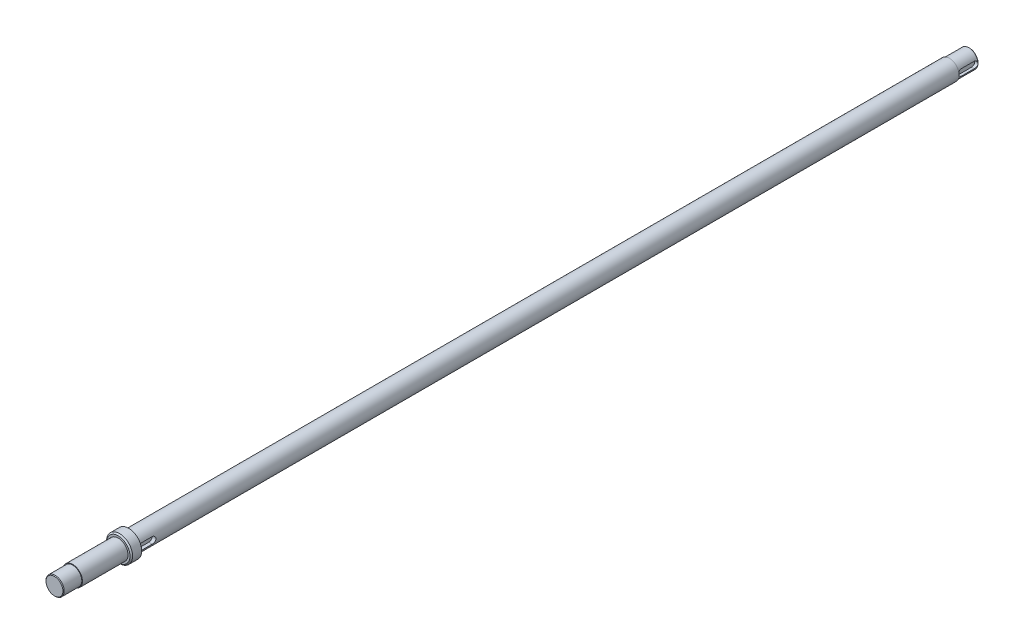
ISO-10303-21;
HEADER;
FILE_DESCRIPTION(('STEP AP214'),'2;1');
FILE_NAME('part.step','',(''),(''),'','','');
FILE_SCHEMA(('AUTOMOTIVE_DESIGN { 1 0 10303 214 1 1 1 1 }'));
ENDSEC;
DATA;
#1=APPLICATION_CONTEXT('core data for automotive mechanical design processes');
#2=APPLICATION_PROTOCOL_DEFINITION('international standard','automotive_design',2000,#1);
#3=PRODUCT_CONTEXT('',#1,'mechanical');
#4=PRODUCT('Part','Part','',(#3));
#5=PRODUCT_RELATED_PRODUCT_CATEGORY('part','',(#4));
#6=PRODUCT_DEFINITION_FORMATION('','',#4);
#7=PRODUCT_DEFINITION_CONTEXT('part definition',#1,'design');
#8=PRODUCT_DEFINITION('design','',#6,#7);
#9=PRODUCT_DEFINITION_SHAPE('','',#8);
#10=(LENGTH_UNIT() NAMED_UNIT(*) SI_UNIT(.MILLI.,.METRE.));
#11=(NAMED_UNIT(*) PLANE_ANGLE_UNIT() SI_UNIT($,.RADIAN.));
#12=(NAMED_UNIT(*) SI_UNIT($,.STERADIAN.) SOLID_ANGLE_UNIT());
#13=UNCERTAINTY_MEASURE_WITH_UNIT(LENGTH_MEASURE(1.E-05),#10,'distance_accuracy_value','');
#14=(GEOMETRIC_REPRESENTATION_CONTEXT(3) GLOBAL_UNCERTAINTY_ASSIGNED_CONTEXT((#13)) GLOBAL_UNIT_ASSIGNED_CONTEXT((#10,
#11,#12)) REPRESENTATION_CONTEXT('',''));
#15=CARTESIAN_POINT('',(0.,0.,0.));
#16=DIRECTION('',(0.,0.,1.));
#17=DIRECTION('',(1.,0.,0.));
#18=AXIS2_PLACEMENT_3D('',#15,#16,#17);
#19=CARTESIAN_POINT('',(0.,0.,0.));
#20=DIRECTION('',(0.,0.,-1.));
#21=DIRECTION('',(-1.,0.,0.));
#22=AXIS2_PLACEMENT_3D('',#19,#20,#21);
#23=CYLINDRICAL_SURFACE('',#22,7.5);
#24=CARTESIAN_POINT('',(0.,0.,-57.));
#25=DIRECTION('',(0.,0.,-1.));
#26=DIRECTION('',(-1.,0.,0.));
#27=AXIS2_PLACEMENT_3D('',#24,#25,#26);
#28=CIRCLE('',#27,7.5);
#29=CARTESIAN_POINT('',(-7.5,0.,-57.));
#30=VERTEX_POINT('',#29);
#31=EDGE_CURVE('E168',#30,#30,#28,.T.);
#32=ORIENTED_EDGE('',*,*,#31,.T.);
#33=EDGE_LOOP('',(#32));
#34=FACE_BOUND('',#33,.T.);
#35=CARTESIAN_POINT('',(0.,0.,-687.5));
#36=DIRECTION('',(0.,0.,-1.));
#37=DIRECTION('',(-1.,0.,0.));
#38=AXIS2_PLACEMENT_3D('',#35,#36,#37);
#39=CIRCLE('',#38,7.5);
#40=CARTESIAN_POINT('',(-7.5,0.,-687.5));
#41=VERTEX_POINT('',#40);
#42=EDGE_CURVE('E165',#41,#41,#39,.T.);
#43=ORIENTED_EDGE('',*,*,#42,.F.);
#44=EDGE_LOOP('',(#43));
#45=FACE_BOUND('',#44,.T.);
#46=DIRECTION('',(0.,0.,-1.));
#47=VECTOR('',#46,1.);
#48=CARTESIAN_POINT('',(7.07106781186548,-2.5,0.));
#49=LINE('',#48,#47);
#50=CARTESIAN_POINT('',(7.07106781186548,-2.5,-68.));
#51=VERTEX_POINT('',#50);
#52=CARTESIAN_POINT('',(7.07106781186548,-2.5,-60.));
#53=VERTEX_POINT('',#52);
#54=EDGE_CURVE('E260',#51,#53,#49,.F.);
#55=ORIENTED_EDGE('',*,*,#54,.T.);
#56=CARTESIAN_POINT('',(7.07106781186548,-2.5,-60.));
#57=CARTESIAN_POINT('',(7.07105693273157,-2.50000899110406,-59.9317929221797));
#58=CARTESIAN_POINT('',(7.07205443904569,-2.49720887221585,-59.8635919253246));
#59=CARTESIAN_POINT('',(7.07598524121008,-2.4860604578047,-59.7277189616508));
#60=CARTESIAN_POINT('',(7.07891801450643,-2.47771365997202,-59.660046857012));
#61=CARTESIAN_POINT('',(7.08662705252507,-2.45557459422795,-59.5259095116455));
#62=CARTESIAN_POINT('',(7.09139784850119,-2.44179847763135,-59.4594412974491));
#63=CARTESIAN_POINT('',(7.10262619906003,-2.4089418103012,-59.3279917314172));
#64=CARTESIAN_POINT('',(7.10908381460331,-2.38986106786032,-59.2630104334101));
#65=CARTESIAN_POINT('',(7.13069940793912,-2.32491551306196,-59.0710384202854));
#66=CARTESIAN_POINT('',(7.14811243884052,-2.2713141681025,-58.94682084253));
#67=CARTESIAN_POINT('',(7.1869703408752,-2.14517784106255,-58.7091231885366));
#68=CARTESIAN_POINT('',(7.20841768551077,-2.07263123268532,-58.5956497642198));
#69=CARTESIAN_POINT('',(7.25386182389479,-1.90762995846819,-58.3782070965292));
#70=CARTESIAN_POINT('',(7.27792189428067,-1.81456284630833,-58.2747148572318));
#71=CARTESIAN_POINT('',(7.32534626726038,-1.61247071190512,-58.0844828967663));
#72=CARTESIAN_POINT('',(7.34871044533519,-1.50344285413658,-57.997746158681));
#73=CARTESIAN_POINT('',(7.39284706096344,-1.26900922493972,-57.8413017757375));
#74=CARTESIAN_POINT('',(7.41353593532888,-1.1432502528446,-57.7720976922578));
#75=CARTESIAN_POINT('',(7.44924021883279,-0.881073095475285,-57.6560192175653));
#76=CARTESIAN_POINT('',(7.46425736081204,-0.744658181225881,-57.6091380050743));
#77=CARTESIAN_POINT('',(7.48647677762783,-0.470073371182907,-57.5406607237417));
#78=CARTESIAN_POINT('',(7.49393272446142,-0.332129588153742,-57.5182418290428));
#79=CARTESIAN_POINT('',(7.50109021034827,-0.0542474216361996,-57.4967092432615));
#80=CARTESIAN_POINT('',(7.50079359709905,0.0856904786402157,-57.4975899990842));
#81=CARTESIAN_POINT('',(7.49265096581776,0.357759612692403,-57.5221107104005));
#82=CARTESIAN_POINT('',(7.48510152476447,0.489981756428172,-57.5448565956047));
#83=CARTESIAN_POINT('',(7.46367401253772,0.748610161077311,-57.6109829959792));
#84=CARTESIAN_POINT('',(7.4497955904479,0.875016099077737,-57.6543646553253));
#85=CARTESIAN_POINT('',(7.41689170677793,1.12038155754034,-57.7610534241945));
#86=CARTESIAN_POINT('',(7.39780094595656,1.23922126412503,-57.8246151128576));
#87=CARTESIAN_POINT('',(7.35645969200236,1.46481147275367,-57.969649878425));
#88=CARTESIAN_POINT('',(7.33420833994017,1.57155867428943,-58.0511278276021));
#89=CARTESIAN_POINT('',(7.28765679856813,1.77524334927518,-58.234177625007));
#90=CARTESIAN_POINT('',(7.26330946699776,1.87148402903098,-58.3365138590283));
#91=CARTESIAN_POINT('',(7.21618726182138,2.04568006205172,-58.5561037242864));
#92=CARTESIAN_POINT('',(7.19341289789386,2.12362950795974,-58.673362156007));
#93=CARTESIAN_POINT('',(7.15175078440791,2.26000831398175,-58.9217004458843));
#94=CARTESIAN_POINT('',(7.13292537370586,2.31813252376915,-59.0529587873326));
#95=CARTESIAN_POINT('',(7.10202742655098,2.41115057675285,-59.3241174439746));
#96=CARTESIAN_POINT('',(7.08994423522482,2.4460810901384,-59.4640037334303));
#97=CARTESIAN_POINT('',(7.078413552368,2.47914539070207,-59.67104659187));
#98=CARTESIAN_POINT('',(7.07566669236505,2.48696265313779,-59.7366034746356));
#99=CARTESIAN_POINT('',(7.07199258928498,2.49738654017799,-59.8680951959995));
#100=CARTESIAN_POINT('',(7.0710629982382,2.49999988848745,-59.934029436361));
#101=CARTESIAN_POINT('',(7.07106781186548,2.5,-60.));
#102=B_SPLINE_CURVE_WITH_KNOTS('',3,(#56,#57,#58,#59,#60,#61,#62,#63,#64,#65,#66,#67,#68,#69,
#70,#71,#72,#73,#74,#75,#76,#77,#78,#79,#80,#81,#82,#83,#84,#85,#86,#87,#88,#89,#90,#91,#92,#93,
#94,#95,#96,#97,#98,#99,#100,#101),.UNSPECIFIED.,.F.,.F.,(4,2,2,2,2,2,2,2,2,2,2,2,2,2,2,2,2,2,2,
2,2,2,4),(0.,0.204546211838573,0.409037215423649,0.612924429429071,0.816819012805388,
1.22401016923255,1.63145179965523,2.0532786408839,2.47518051341064,2.90809434014449,
3.34087579484514,3.75860278500203,4.17623021758301,4.57747647846033,4.97874498952315,
5.38529148746614,5.79194868153617,6.21771736826821,6.64362337304801,7.07581676501795,
7.50732520398793,7.70536340013573,7.90314555504337),.UNSPECIFIED.);
#103=CARTESIAN_POINT('',(7.07106781186548,2.5,-60.));
#104=VERTEX_POINT('',#103);
#105=EDGE_CURVE('E116',#53,#104,#102,.T.);
#106=ORIENTED_EDGE('',*,*,#105,.T.);
#107=DIRECTION('',(0.,0.,-1.));
#108=VECTOR('',#107,1.);
#109=CARTESIAN_POINT('',(7.07106781186548,2.5,0.));
#110=LINE('',#109,#108);
#111=CARTESIAN_POINT('',(7.07106781186548,2.5,-68.));
#112=VERTEX_POINT('',#111);
#113=EDGE_CURVE('E273',#112,#104,#110,.F.);
#114=ORIENTED_EDGE('',*,*,#113,.F.);
#115=CARTESIAN_POINT('',(7.07106781186548,2.5,-68.));
#116=CARTESIAN_POINT('',(7.07105693273157,2.50000899110406,-68.0682070778203));
#117=CARTESIAN_POINT('',(7.07205443904569,2.49720887221585,-68.1364080746754));
#118=CARTESIAN_POINT('',(7.07598524121008,2.4860604578047,-68.2722810383492));
#119=CARTESIAN_POINT('',(7.07891801450643,2.47771365997202,-68.3399531429881));
#120=CARTESIAN_POINT('',(7.08662705252507,2.45557459422795,-68.4740904883545));
#121=CARTESIAN_POINT('',(7.09139784850119,2.44179847763136,-68.5405587025509));
#122=CARTESIAN_POINT('',(7.10262619906002,2.4089418103012,-68.6720082685828));
#123=CARTESIAN_POINT('',(7.10908381460331,2.38986106786032,-68.7369895665899));
#124=CARTESIAN_POINT('',(7.13069940793912,2.32491551306196,-68.9289615797146));
#125=CARTESIAN_POINT('',(7.14811243884052,2.2713141681025,-69.05317915747));
#126=CARTESIAN_POINT('',(7.1869703408752,2.14517784106255,-69.2908768114634));
#127=CARTESIAN_POINT('',(7.20841768551077,2.07263123268532,-69.4043502357802));
#128=CARTESIAN_POINT('',(7.25386182389479,1.90762995846819,-69.6217929034708));
#129=CARTESIAN_POINT('',(7.27792189428067,1.81456284630833,-69.7252851427682));
#130=CARTESIAN_POINT('',(7.32534626726038,1.61247071190513,-69.9155171032337));
#131=CARTESIAN_POINT('',(7.34871044533518,1.50344285413658,-70.002253841319));
#132=CARTESIAN_POINT('',(7.39284706096344,1.26900922493972,-70.1586982242625));
#133=CARTESIAN_POINT('',(7.41353593532888,1.14325025284461,-70.2279023077422));
#134=CARTESIAN_POINT('',(7.44924021883279,0.881073095475288,-70.3439807824347));
#135=CARTESIAN_POINT('',(7.46425736081204,0.74465818122588,-70.3908619949257));
#136=CARTESIAN_POINT('',(7.48647677762783,0.470073371182903,-70.4593392762583));
#137=CARTESIAN_POINT('',(7.49393272446142,0.33212958815374,-70.4817581709572));
#138=CARTESIAN_POINT('',(7.50109021034827,0.0542474216361989,-70.5032907567385));
#139=CARTESIAN_POINT('',(7.50079359709905,-0.0856904786402158,-70.5024100009158));
#140=CARTESIAN_POINT('',(7.49265096581776,-0.357759612692405,-70.4778892895995));
#141=CARTESIAN_POINT('',(7.48510152476447,-0.489981756428177,-70.4551434043953));
#142=CARTESIAN_POINT('',(7.46367401253772,-0.748610161077317,-70.3890170040208));
#143=CARTESIAN_POINT('',(7.4497955904479,-0.87501609907774,-70.3456353446747));
#144=CARTESIAN_POINT('',(7.41689170677793,-1.12038155754035,-70.2389465758056));
#145=CARTESIAN_POINT('',(7.39780094595656,-1.23922126412503,-70.1753848871424));
#146=CARTESIAN_POINT('',(7.35645969200236,-1.46481147275367,-70.030350121575));
#147=CARTESIAN_POINT('',(7.33420833994017,-1.57155867428943,-69.9488721723979));
#148=CARTESIAN_POINT('',(7.28765679856813,-1.77524334927518,-69.765822374993));
#149=CARTESIAN_POINT('',(7.26330946699776,-1.87148402903098,-69.6634861409718));
#150=CARTESIAN_POINT('',(7.21618726182137,-2.04568006205173,-69.4438962757136));
#151=CARTESIAN_POINT('',(7.19341289789386,-2.12362950795974,-69.326637843993));
#152=CARTESIAN_POINT('',(7.15175078440791,-2.26000831398175,-69.0782995541157));
#153=CARTESIAN_POINT('',(7.13292537370586,-2.31813252376915,-68.9470412126674));
#154=CARTESIAN_POINT('',(7.10202742655098,-2.41115057675285,-68.6758825560254));
#155=CARTESIAN_POINT('',(7.08994423522482,-2.4460810901384,-68.5359962665697));
#156=CARTESIAN_POINT('',(7.078413552368,-2.47914539070207,-68.32895340813));
#157=CARTESIAN_POINT('',(7.07566669236505,-2.48696265313778,-68.2633965253644));
#158=CARTESIAN_POINT('',(7.07199258928497,-2.49738654017799,-68.1319048040005));
#159=CARTESIAN_POINT('',(7.0710629982382,-2.49999988848745,-68.065970563639));
#160=CARTESIAN_POINT('',(7.07106781186548,-2.5,-68.));
#161=B_SPLINE_CURVE_WITH_KNOTS('',3,(#115,#116,#117,#118,#119,#120,#121,#122,#123,#124,#125,
#126,#127,#128,#129,#130,#131,#132,#133,#134,#135,#136,#137,#138,#139,#140,#141,#142,#143,#144,
#145,#146,#147,#148,#149,#150,#151,#152,#153,#154,#155,#156,#157,#158,#159,#160),.UNSPECIFIED.,
.F.,.F.,(4,2,2,2,2,2,2,2,2,2,2,2,2,2,2,2,2,2,2,2,2,2,4),(0.,0.204546211838573,0.409037215423635,
0.61292442942907,0.816819012805388,1.22401016923255,1.63145179965522,2.05327864088388,
2.47518051341063,2.90809434014448,3.34087579484514,3.75860278500202,4.17623021758301,
4.57747647846033,4.97874498952315,5.38529148746615,5.79194868153616,6.21771736826821,
6.64362337304802,7.07581676501795,7.50732520398793,7.70536340013573,7.90314555504336),.UNSPECIFIED.);
#162=EDGE_CURVE('E244',#112,#51,#161,.T.);
#163=ORIENTED_EDGE('',*,*,#162,.T.);
#164=EDGE_LOOP('',(#55,#106,#114,#163));
#165=FACE_BOUND('',#164,.T.);
#166=ADVANCED_FACE('F37',(#34,#45,#165),#23,.T.);
#167=CARTESIAN_POINT('',(0.,0.,0.));
#168=DIRECTION('',(0.,0.,-1.));
#169=DIRECTION('',(-1.,0.,0.));
#170=AXIS2_PLACEMENT_3D('',#167,#168,#169);
#171=CYLINDRICAL_SURFACE('',#170,7.);
#172=CARTESIAN_POINT('',(6.53834841531101,2.5,-700.));
#173=CARTESIAN_POINT('',(6.53833653785132,2.50000932220905,-700.067889245729));
#174=CARTESIAN_POINT('',(6.53940549922738,2.49723485076695,-700.135771932639));
#175=CARTESIAN_POINT('',(6.54361657478133,2.4861910211816,-700.271003910611));
#176=CARTESIAN_POINT('',(6.54675805418062,2.47792334551208,-700.338353358606));
#177=CARTESIAN_POINT('',(6.55501217637942,2.456001752859,-700.471821414603));
#178=CARTESIAN_POINT('',(6.56011831705676,2.44236559963955,-700.53794333634));
#179=CARTESIAN_POINT('',(6.57213177854175,2.40985115466648,-700.668701835108));
#180=CARTESIAN_POINT('',(6.57903917900746,2.39097263107435,-700.733338346312));
#181=CARTESIAN_POINT('',(6.6021493436571,2.32673964179204,-700.924264366477));
#182=CARTESIAN_POINT('',(6.62075475340845,2.27375112606984,-701.047790452136));
#183=CARTESIAN_POINT('',(6.66225397360711,2.14910757865423,-701.284230333128));
#184=CARTESIAN_POINT('',(6.68515090424876,2.07743895048848,-701.397136316736));
#185=CARTESIAN_POINT('',(6.73379913792223,1.91402571101972,-701.614215213353));
#186=CARTESIAN_POINT('',(6.7596286404137,1.82158337146748,-701.717846475196));
#187=CARTESIAN_POINT('',(6.81057592323029,1.62073388776336,-701.908508704716));
#188=CARTESIAN_POINT('',(6.83569357019867,1.51232377552679,-701.995536579243));
#189=CARTESIAN_POINT('',(6.88331133279045,1.27853915335942,-702.153089855455));
#190=CARTESIAN_POINT('',(6.90570835223795,1.15274833789196,-702.223031521861));
#191=CARTESIAN_POINT('',(6.94442357672632,0.890250825476732,-702.340536646797));
#192=CARTESIAN_POINT('',(6.96074386585465,0.75354789054038,-702.388107779046));
#193=CARTESIAN_POINT('',(6.9849105051071,0.478829979256186,-702.457640602182));
#194=CARTESIAN_POINT('',(6.99306594352515,0.341079835227481,-702.480539130471));
#195=CARTESIAN_POINT('',(7.00108798053822,0.0634643052969114,-702.503068402778));
#196=CARTESIAN_POINT('',(7.00095687302702,-0.076400484507451,-702.502705586035));
#197=CARTESIAN_POINT('',(6.99262258049077,-0.347593258486963,-702.479288726239));
#198=CARTESIAN_POINT('',(6.98478243583516,-0.479022407078743,-702.457255205801));
#199=CARTESIAN_POINT('',(6.96237832507347,-0.736175812143632,-702.392826575841));
#200=CARTESIAN_POINT('',(6.94781397899037,-0.861899745780486,-702.350430315637));
#201=CARTESIAN_POINT('',(6.91316506890368,-1.10616102429809,-702.245953088435));
#202=CARTESIAN_POINT('',(6.89300592164314,-1.22457279066908,-702.18360428504));
#203=CARTESIAN_POINT('',(6.8492335561632,-1.44953531305526,-702.041220664777));
#204=CARTESIAN_POINT('',(6.82561928959262,-1.55608245176773,-701.961180476216));
#205=CARTESIAN_POINT('',(6.77590547805488,-1.76032445256074,-701.780676736343));
#206=CARTESIAN_POINT('',(6.74974055843873,-1.85724185700423,-701.679350276855));
#207=CARTESIAN_POINT('',(6.69890342468975,-2.03299914621298,-701.461672635834));
#208=CARTESIAN_POINT('',(6.67423174765257,-2.1118325545646,-701.345316094832));
#209=CARTESIAN_POINT('',(6.62877803875406,-2.25049860898456,-701.098057401478));
#210=CARTESIAN_POINT('',(6.60807875118994,-2.30994207989625,-700.966921024495));
#211=CARTESIAN_POINT('',(6.57388213610267,-2.40555439725851,-700.695635198418));
#212=CARTESIAN_POINT('',(6.56037307165053,-2.44176119399954,-700.555500858831));
#213=CARTESIAN_POINT('',(6.54708542245562,-2.47705497148626,-700.344969455736));
#214=CARTESIAN_POINT('',(6.54382010967907,-2.48565347586444,-700.276263698228));
#215=CARTESIAN_POINT('',(6.53944910829676,-2.49712352174881,-700.138384835808));
#216=CARTESIAN_POINT('',(6.53834103140935,-2.50000139665367,-700.069212332899));
#217=CARTESIAN_POINT('',(6.53834841531101,-2.5,-700.));
#218=B_SPLINE_CURVE_WITH_KNOTS('',3,(#172,#173,#174,#175,#176,#177,#178,#179,#180,#181,#182,
#183,#184,#185,#186,#187,#188,#189,#190,#191,#192,#193,#194,#195,#196,#197,#198,#199,#200,#201,
#202,#203,#204,#205,#206,#207,#208,#209,#210,#211,#212,#213,#214,#215,#216,#217),.UNSPECIFIED.,
.F.,.F.,(4,2,2,2,2,2,2,2,2,2,2,2,2,2,2,2,2,2,2,2,2,2,4),(0.,0.203591628551613,0.407120929225424,
0.609982356545811,0.812852756635974,1.21793118555519,1.62330528148463,2.04515972311917,
2.46709267811831,2.90188398965546,3.33652604665234,3.75400993940859,4.17137826416922,
4.56998920861349,4.96862268086887,5.37284909448642,5.77719841367923,6.20315837945089,
6.62927065674716,7.06347329058497,7.49696496492438,7.70468580162762,7.9121765389639),.UNSPECIFIED.);
#219=CARTESIAN_POINT('',(6.53834841531101,2.5,-700.));
#220=VERTEX_POINT('',#219);
#221=CARTESIAN_POINT('',(7.00000000000099,-2.71449623025347E-13,-702.500000000003));
#222=VERTEX_POINT('',#221);
#223=EDGE_CURVE('E186',#220,#222,#218,.T.);
#224=ORIENTED_EDGE('',*,*,#223,.T.);
#225=CARTESIAN_POINT('',(0.,0.,-702.5));
#226=DIRECTION('',(0.,0.,-1.));
#227=DIRECTION('',(-1.,0.,0.));
#228=AXIS2_PLACEMENT_3D('',#225,#226,#227);
#229=CIRCLE('',#228,7.);
#230=EDGE_CURVE('E51',#222,#222,#229,.F.);
#231=ORIENTED_EDGE('',*,*,#230,.T.);
#232=CARTESIAN_POINT('',(6.53834841531101,-2.5,-700.));
#233=VERTEX_POINT('',#232);
#234=EDGE_CURVE('E185',#222,#233,#218,.T.);
#235=ORIENTED_EDGE('',*,*,#234,.T.);
#236=DIRECTION('',(0.,0.,-1.));
#237=VECTOR('',#236,1.);
#238=CARTESIAN_POINT('',(6.53834841531101,-2.5,0.));
#239=LINE('',#238,#237);
#240=CARTESIAN_POINT('',(6.53834841531101,-2.5,-690.));
#241=VERTEX_POINT('',#240);
#242=EDGE_CURVE('E195',#233,#241,#239,.F.);
#243=ORIENTED_EDGE('',*,*,#242,.T.);
#244=CARTESIAN_POINT('',(6.53834841531101,-2.5,-690.));
#245=CARTESIAN_POINT('',(6.53833653785132,-2.50000932220905,-689.932110754271));
#246=CARTESIAN_POINT('',(6.53940549922738,-2.49723485076695,-689.864228067361));
#247=CARTESIAN_POINT('',(6.54361657478133,-2.4861910211816,-689.728996089388));
#248=CARTESIAN_POINT('',(6.54675805418062,-2.47792334551208,-689.661646641394));
#249=CARTESIAN_POINT('',(6.55501217637941,-2.45600175285901,-689.528178585397));
#250=CARTESIAN_POINT('',(6.56011831705675,-2.44236559963956,-689.46205666366));
#251=CARTESIAN_POINT('',(6.57213177854174,-2.4098511546665,-689.331298164891));
#252=CARTESIAN_POINT('',(6.57903917900746,-2.39097263107436,-689.266661653688));
#253=CARTESIAN_POINT('',(6.6021493436571,-2.32673964179204,-689.075735633522));
#254=CARTESIAN_POINT('',(6.62075475340845,-2.27375112606984,-688.952209547864));
#255=CARTESIAN_POINT('',(6.66225397360711,-2.14910757865423,-688.715769666872));
#256=CARTESIAN_POINT('',(6.68515090424876,-2.07743895048848,-688.602863683264));
#257=CARTESIAN_POINT('',(6.73379913792223,-1.91402571101972,-688.385784786647));
#258=CARTESIAN_POINT('',(6.7596286404137,-1.82158337146748,-688.282153524804));
#259=CARTESIAN_POINT('',(6.81057592323029,-1.62073388776336,-688.091491295284));
#260=CARTESIAN_POINT('',(6.83569357019866,-1.51232377552679,-688.004463420757));
#261=CARTESIAN_POINT('',(6.88331133279045,-1.2785391533594,-687.846910144545));
#262=CARTESIAN_POINT('',(6.90570835223796,-1.1527483378919,-687.776968478139));
#263=CARTESIAN_POINT('',(6.94442357672633,-0.890250825476671,-687.659463353203));
#264=CARTESIAN_POINT('',(6.96074386585465,-0.753547890540351,-687.611892220954));
#265=CARTESIAN_POINT('',(6.9849105051071,-0.478829979256186,-687.542359397818));
#266=CARTESIAN_POINT('',(6.99306594352515,-0.341079835227476,-687.519460869529));
#267=CARTESIAN_POINT('',(7.00108798053822,-0.0634643052969044,-687.496931597222));
#268=CARTESIAN_POINT('',(7.00095687302702,0.0764004845074542,-687.497294413965));
#269=CARTESIAN_POINT('',(6.99262258049077,0.347593258486963,-687.520711273761));
#270=CARTESIAN_POINT('',(6.98478243583516,0.479022407078743,-687.542744794198));
#271=CARTESIAN_POINT('',(6.96237832507347,0.736175812143632,-687.607173424159));
#272=CARTESIAN_POINT('',(6.94781397899037,0.861899745780486,-687.649569684363));
#273=CARTESIAN_POINT('',(6.91316506890368,1.10616102429809,-687.754046911565));
#274=CARTESIAN_POINT('',(6.89300592164314,1.22457279066908,-687.81639571496));
#275=CARTESIAN_POINT('',(6.8492335561632,1.44953531305526,-687.958779335223));
#276=CARTESIAN_POINT('',(6.82561928959262,1.55608245176773,-688.038819523784));
#277=CARTESIAN_POINT('',(6.77590547805488,1.76032445256074,-688.219323263657));
#278=CARTESIAN_POINT('',(6.74974055843873,1.85724185700423,-688.320649723145));
#279=CARTESIAN_POINT('',(6.69890342468975,2.03299914621298,-688.538327364166));
#280=CARTESIAN_POINT('',(6.67423174765257,2.11183255456461,-688.654683905168));
#281=CARTESIAN_POINT('',(6.62877803875406,2.25049860898455,-688.901942598522));
#282=CARTESIAN_POINT('',(6.60807875118995,2.30994207989624,-689.033078975505));
#283=CARTESIAN_POINT('',(6.57388213610267,2.4055543972585,-689.304364801582));
#284=CARTESIAN_POINT('',(6.56037307165053,2.44176119399954,-689.444499141169));
#285=CARTESIAN_POINT('',(6.54708542245562,2.47705497148626,-689.655030544264));
#286=CARTESIAN_POINT('',(6.54382010967907,2.48565347586444,-689.723736301772));
#287=CARTESIAN_POINT('',(6.53944910829676,2.49712352174881,-689.861615164192));
#288=CARTESIAN_POINT('',(6.53834103140935,2.50000139665367,-689.9307876671));
#289=CARTESIAN_POINT('',(6.53834841531101,2.5,-690.));
#290=B_SPLINE_CURVE_WITH_KNOTS('',3,(#244,#245,#246,#247,#248,#249,#250,#251,#252,#253,#254,
#255,#256,#257,#258,#259,#260,#261,#262,#263,#264,#265,#266,#267,#268,#269,#270,#271,#272,#273,
#274,#275,#276,#277,#278,#279,#280,#281,#282,#283,#284,#285,#286,#287,#288,#289),.UNSPECIFIED.,
.F.,.F.,(4,2,2,2,2,2,2,2,2,2,2,2,2,2,2,2,2,2,2,2,2,2,4),(0.,0.203591628551613,0.407120929225424,
0.609982356545697,0.812852756635974,1.21793118555519,1.62330528148463,2.04515972311917,
2.46709267811831,2.90188398965553,3.33652604665233,3.75400993940859,4.17137826416922,
4.56998920861348,4.96862268086886,5.37284909448642,5.77719841367922,6.20315837945089,
6.62927065674715,7.06347329058496,7.49696496492438,7.70468580162762,7.9121765389639),.UNSPECIFIED.);
#291=CARTESIAN_POINT('',(7.00000000000099,2.71449622198167E-13,-687.499999999997));
#292=VERTEX_POINT('',#291);
#293=EDGE_CURVE('E272',#241,#292,#290,.T.);
#294=ORIENTED_EDGE('',*,*,#293,.T.);
#295=CARTESIAN_POINT('',(0.,0.,-687.5));
#296=DIRECTION('',(0.,0.,-1.));
#297=DIRECTION('',(-1.,0.,0.));
#298=AXIS2_PLACEMENT_3D('',#295,#296,#297);
#299=CIRCLE('',#298,7.);
#300=EDGE_CURVE('E119',#292,#292,#299,.T.);
#301=ORIENTED_EDGE('',*,*,#300,.T.);
#302=CARTESIAN_POINT('',(6.53834841531101,2.5,-690.));
#303=VERTEX_POINT('',#302);
#304=EDGE_CURVE('E266',#292,#303,#290,.T.);
#305=ORIENTED_EDGE('',*,*,#304,.T.);
#306=DIRECTION('',(0.,0.,-1.));
#307=VECTOR('',#306,1.);
#308=CARTESIAN_POINT('',(6.53834841531101,2.5,0.));
#309=LINE('',#308,#307);
#310=EDGE_CURVE('E183',#220,#303,#309,.F.);
#311=ORIENTED_EDGE('',*,*,#310,.F.);
#312=EDGE_LOOP('',(#224,#231,#235,#243,#294,#301,#305,#311));
#313=FACE_BOUND('',#312,.T.);
#314=ADVANCED_FACE('F197',(#313),#171,.T.);
#315=CARTESIAN_POINT('',(0.,0.,0.));
#316=DIRECTION('',(0.,0.,1.));
#317=DIRECTION('',(1.,0.,0.));
#318=AXIS2_PLACEMENT_3D('',#315,#316,#317);
#319=PLANE('',#318);
#320=CARTESIAN_POINT('',(0.,0.,0.));
#321=DIRECTION('',(0.,0.,1.));
#322=DIRECTION('',(1.,0.,0.));
#323=AXIS2_PLACEMENT_3D('',#320,#321,#322);
#324=CIRCLE('',#323,6.50000000000001);
#325=CARTESIAN_POINT('',(6.50000000000001,0.,0.));
#326=VERTEX_POINT('',#325);
#327=EDGE_CURVE('E11',#326,#326,#324,.T.);
#328=ORIENTED_EDGE('',*,*,#327,.T.);
#329=EDGE_LOOP('',(#328));
#330=FACE_BOUND('',#329,.T.);
#331=ADVANCED_FACE('F236',(#330),#319,.T.);
#332=CARTESIAN_POINT('',(0.,0.,0.));
#333=DIRECTION('',(0.,0.,-1.));
#334=DIRECTION('',(-1.,0.,0.));
#335=AXIS2_PLACEMENT_3D('',#332,#333,#334);
#336=CYLINDRICAL_SURFACE('',#335,7.);
#337=CARTESIAN_POINT('',(0.,0.,-0.499999999999967));
#338=DIRECTION('',(0.,0.,1.));
#339=DIRECTION('',(1.,0.,0.));
#340=AXIS2_PLACEMENT_3D('',#337,#338,#339);
#341=CIRCLE('',#340,7.);
#342=CARTESIAN_POINT('',(7.,0.,-0.499999999999967));
#343=VERTEX_POINT('',#342);
#344=EDGE_CURVE('E46',#343,#343,#341,.F.);
#345=ORIENTED_EDGE('',*,*,#344,.T.);
#346=EDGE_LOOP('',(#345));
#347=FACE_BOUND('',#346,.T.);
#348=CARTESIAN_POINT('',(0.,0.,-14.));
#349=DIRECTION('',(0.,0.,-1.));
#350=DIRECTION('',(-1.,0.,0.));
#351=AXIS2_PLACEMENT_3D('',#348,#349,#350);
#352=CIRCLE('',#351,7.);
#353=CARTESIAN_POINT('',(-7.,0.,-14.));
#354=VERTEX_POINT('',#353);
#355=EDGE_CURVE('E180',#354,#354,#352,.T.);
#356=ORIENTED_EDGE('',*,*,#355,.F.);
#357=EDGE_LOOP('',(#356));
#358=FACE_BOUND('',#357,.T.);
#359=ADVANCED_FACE('F354',(#347,#358),#336,.T.);
#360=CARTESIAN_POINT('',(0.,7.,-14.));
#361=DIRECTION('',(0.,0.,1.));
#362=DIRECTION('',(1.,0.,0.));
#363=AXIS2_PLACEMENT_3D('',#360,#361,#362);
#364=PLANE('',#363);
#365=ORIENTED_EDGE('',*,*,#355,.T.);
#366=EDGE_LOOP('',(#365));
#367=FACE_BOUND('',#366,.T.);
#368=CARTESIAN_POINT('',(0.,0.,-14.));
#369=DIRECTION('',(0.,0.,-1.));
#370=DIRECTION('',(-1.,0.,0.));
#371=AXIS2_PLACEMENT_3D('',#368,#369,#370);
#372=CIRCLE('',#371,7.5);
#373=CARTESIAN_POINT('',(-7.5,0.,-14.));
#374=VERTEX_POINT('',#373);
#375=EDGE_CURVE('E177',#374,#374,#372,.T.);
#376=ORIENTED_EDGE('',*,*,#375,.F.);
#377=EDGE_LOOP('',(#376));
#378=FACE_BOUND('',#377,.T.);
#379=ADVANCED_FACE('F357',(#367,#378),#364,.T.);
#380=CARTESIAN_POINT('',(0.,0.,0.));
#381=DIRECTION('',(0.,0.,-1.));
#382=DIRECTION('',(-1.,0.,0.));
#383=AXIS2_PLACEMENT_3D('',#380,#381,#382);
#384=CYLINDRICAL_SURFACE('',#383,7.5);
#385=ORIENTED_EDGE('',*,*,#375,.T.);
#386=EDGE_LOOP('',(#385));
#387=FACE_BOUND('',#386,.T.);
#388=CARTESIAN_POINT('',(0.,0.,-49.));
#389=DIRECTION('',(0.,0.,-1.));
#390=DIRECTION('',(-1.,0.,0.));
#391=AXIS2_PLACEMENT_3D('',#388,#389,#390);
#392=CIRCLE('',#391,7.5);
#393=CARTESIAN_POINT('',(-7.5,0.,-49.));
#394=VERTEX_POINT('',#393);
#395=EDGE_CURVE('E174',#394,#394,#392,.T.);
#396=ORIENTED_EDGE('',*,*,#395,.F.);
#397=EDGE_LOOP('',(#396));
#398=FACE_BOUND('',#397,.T.);
#399=ADVANCED_FACE('F362',(#387,#398),#384,.T.);
#400=CARTESIAN_POINT('',(0.,7.5,-49.));
#401=DIRECTION('',(0.,0.,1.));
#402=DIRECTION('',(1.,0.,0.));
#403=AXIS2_PLACEMENT_3D('',#400,#401,#402);
#404=PLANE('',#403);
#405=CARTESIAN_POINT('',(0.,0.,-49.));
#406=DIRECTION('',(0.,0.,1.));
#407=DIRECTION('',(1.,0.,0.));
#408=AXIS2_PLACEMENT_3D('',#405,#406,#407);
#409=CIRCLE('',#408,8.9999999999999);
#410=CARTESIAN_POINT('',(8.9999999999999,0.,-49.));
#411=VERTEX_POINT('',#410);
#412=EDGE_CURVE('E301',#411,#411,#409,.T.);
#413=ORIENTED_EDGE('',*,*,#412,.T.);
#414=EDGE_LOOP('',(#413));
#415=FACE_BOUND('',#414,.T.);
#416=ORIENTED_EDGE('',*,*,#395,.T.);
#417=EDGE_LOOP('',(#416));
#418=FACE_BOUND('',#417,.T.);
#419=ADVANCED_FACE('F368',(#415,#418),#404,.T.);
#420=CARTESIAN_POINT('',(0.,0.,0.));
#421=DIRECTION('',(0.,0.,-1.));
#422=DIRECTION('',(-1.,0.,0.));
#423=AXIS2_PLACEMENT_3D('',#420,#421,#422);
#424=CYLINDRICAL_SURFACE('',#423,10.);
#425=CARTESIAN_POINT('',(0.,0.,-50.0000000000001));
#426=DIRECTION('',(0.,0.,1.));
#427=DIRECTION('',(1.,0.,0.));
#428=AXIS2_PLACEMENT_3D('',#425,#426,#427);
#429=CIRCLE('',#428,10.);
#430=CARTESIAN_POINT('',(10.,0.,-50.0000000000001));
#431=VERTEX_POINT('',#430);
#432=EDGE_CURVE('E259',#431,#431,#429,.F.);
#433=ORIENTED_EDGE('',*,*,#432,.T.);
#434=EDGE_LOOP('',(#433));
#435=FACE_BOUND('',#434,.T.);
#436=CARTESIAN_POINT('',(0.,0.,-57.));
#437=DIRECTION('',(0.,0.,-1.));
#438=DIRECTION('',(-1.,0.,0.));
#439=AXIS2_PLACEMENT_3D('',#436,#437,#438);
#440=CIRCLE('',#439,10.);
#441=CARTESIAN_POINT('',(-10.,0.,-57.));
#442=VERTEX_POINT('',#441);
#443=EDGE_CURVE('E171',#442,#442,#440,.T.);
#444=ORIENTED_EDGE('',*,*,#443,.F.);
#445=EDGE_LOOP('',(#444));
#446=FACE_BOUND('',#445,.T.);
#447=ADVANCED_FACE('F308',(#435,#446),#424,.T.);
#448=CARTESIAN_POINT('',(0.,10.,-57.));
#449=DIRECTION('',(0.,0.,-1.));
#450=DIRECTION('',(-1.,0.,0.));
#451=AXIS2_PLACEMENT_3D('',#448,#449,#450);
#452=PLANE('',#451);
#453=ORIENTED_EDGE('',*,*,#443,.T.);
#454=EDGE_LOOP('',(#453));
#455=FACE_BOUND('',#454,.T.);
#456=ORIENTED_EDGE('',*,*,#31,.F.);
#457=EDGE_LOOP('',(#456));
#458=FACE_BOUND('',#457,.T.);
#459=ADVANCED_FACE('F226',(#455,#458),#452,.T.);
#460=CARTESIAN_POINT('',(0.,7.5,-687.5));
#461=DIRECTION('',(0.,0.,-1.));
#462=DIRECTION('',(-1.,0.,0.));
#463=AXIS2_PLACEMENT_3D('',#460,#461,#462);
#464=PLANE('',#463);
#465=ORIENTED_EDGE('',*,*,#42,.T.);
#466=EDGE_LOOP('',(#465));
#467=FACE_BOUND('',#466,.T.);
#468=ORIENTED_EDGE('',*,*,#300,.F.);
#469=EDGE_LOOP('',(#468));
#470=FACE_BOUND('',#469,.T.);
#471=ADVANCED_FACE('F219',(#467,#470),#464,.T.);
#472=CARTESIAN_POINT('',(0.,7.,-703.));
#473=DIRECTION('',(0.,0.,-1.));
#474=DIRECTION('',(-1.,0.,0.));
#475=AXIS2_PLACEMENT_3D('',#472,#473,#474);
#476=PLANE('',#475);
#477=CARTESIAN_POINT('',(0.,0.,-703.));
#478=DIRECTION('',(0.,0.,-1.));
#479=DIRECTION('',(-1.,0.,0.));
#480=AXIS2_PLACEMENT_3D('',#477,#478,#479);
#481=CIRCLE('',#480,3.50000000000017);
#482=CARTESIAN_POINT('',(-3.50000000000017,0.,-703.));
#483=VERTEX_POINT('',#482);
#484=EDGE_CURVE('E291',#483,#483,#481,.F.);
#485=ORIENTED_EDGE('',*,*,#484,.T.);
#486=EDGE_LOOP('',(#485));
#487=FACE_BOUND('',#486,.T.);
#488=CARTESIAN_POINT('',(0.,0.,-703.));
#489=DIRECTION('',(0.,0.,-1.));
#490=DIRECTION('',(-1.,0.,0.));
#491=AXIS2_PLACEMENT_3D('',#488,#489,#490);
#492=CIRCLE('',#491,6.50000000000017);
#493=CARTESIAN_POINT('',(-6.50000000000017,0.,-703.));
#494=VERTEX_POINT('',#493);
#495=EDGE_CURVE('E294',#494,#494,#492,.T.);
#496=ORIENTED_EDGE('',*,*,#495,.T.);
#497=EDGE_LOOP('',(#496));
#498=FACE_BOUND('',#497,.T.);
#499=ADVANCED_FACE('F216',(#487,#498),#476,.T.);
#500=CARTESIAN_POINT('',(10.,0.,-690.));
#501=DIRECTION('',(-1.,0.,0.));
#502=DIRECTION('',(0.,0.,1.));
#503=AXIS2_PLACEMENT_3D('',#500,#501,#502);
#504=CYLINDRICAL_SURFACE('',#503,2.5);
#505=DIRECTION('',(-1.,0.,0.));
#506=VECTOR('',#505,1.);
#507=CARTESIAN_POINT('',(10.,-2.5,-690.));
#508=LINE('',#507,#506);
#509=CARTESIAN_POINT('',(4.5,-2.5,-690.));
#510=VERTEX_POINT('',#509);
#511=EDGE_CURVE('E147',#241,#510,#508,.T.);
#512=ORIENTED_EDGE('',*,*,#511,.T.);
#513=CARTESIAN_POINT('',(4.5,0.,-690.));
#514=DIRECTION('',(1.,0.,0.));
#515=DIRECTION('',(0.,0.,-1.));
#516=AXIS2_PLACEMENT_3D('',#513,#514,#515);
#517=CIRCLE('',#516,2.5);
#518=CARTESIAN_POINT('',(4.5,2.5,-690.));
#519=VERTEX_POINT('',#518);
#520=EDGE_CURVE('E133',#519,#510,#517,.T.);
#521=ORIENTED_EDGE('',*,*,#520,.F.);
#522=DIRECTION('',(-1.,0.,0.));
#523=VECTOR('',#522,1.);
#524=CARTESIAN_POINT('',(10.,2.5,-690.));
#525=LINE('',#524,#523);
#526=EDGE_CURVE('E153',#303,#519,#525,.T.);
#527=ORIENTED_EDGE('',*,*,#526,.F.);
#528=ORIENTED_EDGE('',*,*,#304,.F.);
#529=ORIENTED_EDGE('',*,*,#293,.F.);
#530=EDGE_LOOP('',(#512,#521,#527,#528,#529));
#531=FACE_BOUND('',#530,.T.);
#532=ADVANCED_FACE('F218',(#531),#504,.F.);
#533=CARTESIAN_POINT('',(10.,-2.5,-690.));
#534=DIRECTION('',(0.,1.,0.));
#535=DIRECTION('',(0.,0.,1.));
#536=AXIS2_PLACEMENT_3D('',#533,#534,#535);
#537=PLANE('',#536);
#538=DIRECTION('',(-1.,0.,0.));
#539=VECTOR('',#538,1.);
#540=CARTESIAN_POINT('',(10.,-2.5,-700.));
#541=LINE('',#540,#539);
#542=CARTESIAN_POINT('',(4.5,-2.5,-700.));
#543=VERTEX_POINT('',#542);
#544=EDGE_CURVE('E149',#233,#543,#541,.T.);
#545=ORIENTED_EDGE('',*,*,#544,.T.);
#546=DIRECTION('',(0.,0.,-1.));
#547=VECTOR('',#546,1.);
#548=CARTESIAN_POINT('',(4.5,-2.5,-690.));
#549=LINE('',#548,#547);
#550=EDGE_CURVE('E136',#510,#543,#549,.T.);
#551=ORIENTED_EDGE('',*,*,#550,.F.);
#552=ORIENTED_EDGE('',*,*,#511,.F.);
#553=ORIENTED_EDGE('',*,*,#242,.F.);
#554=EDGE_LOOP('',(#545,#551,#552,#553));
#555=FACE_BOUND('',#554,.T.);
#556=ADVANCED_FACE('F207',(#555),#537,.T.);
#557=CARTESIAN_POINT('',(10.,0.,-700.));
#558=DIRECTION('',(-1.,0.,0.));
#559=DIRECTION('',(0.,0.,1.));
#560=AXIS2_PLACEMENT_3D('',#557,#558,#559);
#561=CYLINDRICAL_SURFACE('',#560,2.5);
#562=DIRECTION('',(-1.,0.,0.));
#563=VECTOR('',#562,1.);
#564=CARTESIAN_POINT('',(10.,2.5,-700.));
#565=LINE('',#564,#563);
#566=CARTESIAN_POINT('',(4.5,2.5,-700.));
#567=VERTEX_POINT('',#566);
#568=EDGE_CURVE('E151',#220,#567,#565,.T.);
#569=ORIENTED_EDGE('',*,*,#568,.T.);
#570=CARTESIAN_POINT('',(4.5,0.,-700.));
#571=DIRECTION('',(1.,0.,0.));
#572=DIRECTION('',(0.,0.,-1.));
#573=AXIS2_PLACEMENT_3D('',#570,#571,#572);
#574=CIRCLE('',#573,2.5);
#575=EDGE_CURVE('E158',#543,#567,#574,.T.);
#576=ORIENTED_EDGE('',*,*,#575,.F.);
#577=ORIENTED_EDGE('',*,*,#544,.F.);
#578=ORIENTED_EDGE('',*,*,#234,.F.);
#579=ORIENTED_EDGE('',*,*,#223,.F.);
#580=EDGE_LOOP('',(#569,#576,#577,#578,#579));
#581=FACE_BOUND('',#580,.T.);
#582=ADVANCED_FACE('F201',(#581),#561,.F.);
#583=CARTESIAN_POINT('',(10.,2.5,-690.));
#584=DIRECTION('',(0.,1.,0.));
#585=DIRECTION('',(0.,0.,1.));
#586=AXIS2_PLACEMENT_3D('',#583,#584,#585);
#587=PLANE('',#586);
#588=ORIENTED_EDGE('',*,*,#310,.T.);
#589=ORIENTED_EDGE('',*,*,#526,.T.);
#590=DIRECTION('',(0.,0.,-1.));
#591=VECTOR('',#590,1.);
#592=CARTESIAN_POINT('',(4.5,2.5,-690.));
#593=LINE('',#592,#591);
#594=EDGE_CURVE('E155',#519,#567,#593,.T.);
#595=ORIENTED_EDGE('',*,*,#594,.T.);
#596=ORIENTED_EDGE('',*,*,#568,.F.);
#597=EDGE_LOOP('',(#588,#589,#595,#596));
#598=FACE_BOUND('',#597,.T.);
#599=ADVANCED_FACE('F206',(#598),#587,.F.);
#600=CARTESIAN_POINT('',(4.5,0.,-690.));
#601=DIRECTION('',(1.,0.,0.));
#602=DIRECTION('',(0.,0.,-1.));
#603=AXIS2_PLACEMENT_3D('',#600,#601,#602);
#604=PLANE('',#603);
#605=ORIENTED_EDGE('',*,*,#520,.T.);
#606=ORIENTED_EDGE('',*,*,#550,.T.);
#607=ORIENTED_EDGE('',*,*,#575,.T.);
#608=ORIENTED_EDGE('',*,*,#594,.F.);
#609=EDGE_LOOP('',(#605,#606,#607,#608));
#610=FACE_BOUND('',#609,.T.);
#611=ADVANCED_FACE('F212',(#610),#604,.T.);
#612=CARTESIAN_POINT('',(10.,0.,-60.));
#613=DIRECTION('',(-1.,0.,0.));
#614=DIRECTION('',(0.,0.,1.));
#615=AXIS2_PLACEMENT_3D('',#612,#613,#614);
#616=CYLINDRICAL_SURFACE('',#615,2.5);
#617=DIRECTION('',(-1.,0.,0.));
#618=VECTOR('',#617,1.);
#619=CARTESIAN_POINT('',(10.,-2.5,-60.));
#620=LINE('',#619,#618);
#621=CARTESIAN_POINT('',(4.5,-2.5,-60.));
#622=VERTEX_POINT('',#621);
#623=EDGE_CURVE('E108',#53,#622,#620,.T.);
#624=ORIENTED_EDGE('',*,*,#623,.T.);
#625=CARTESIAN_POINT('',(4.5,0.,-60.));
#626=DIRECTION('',(1.,0.,0.));
#627=DIRECTION('',(0.,0.,-1.));
#628=AXIS2_PLACEMENT_3D('',#625,#626,#627);
#629=CIRCLE('',#628,2.5);
#630=CARTESIAN_POINT('',(4.5,2.5,-60.));
#631=VERTEX_POINT('',#630);
#632=EDGE_CURVE('E113',#631,#622,#629,.T.);
#633=ORIENTED_EDGE('',*,*,#632,.F.);
#634=DIRECTION('',(-1.,0.,0.));
#635=VECTOR('',#634,1.);
#636=CARTESIAN_POINT('',(10.,2.5,-60.));
#637=LINE('',#636,#635);
#638=EDGE_CURVE('E143',#104,#631,#637,.T.);
#639=ORIENTED_EDGE('',*,*,#638,.F.);
#640=ORIENTED_EDGE('',*,*,#105,.F.);
#641=EDGE_LOOP('',(#624,#633,#639,#640));
#642=FACE_BOUND('',#641,.T.);
#643=ADVANCED_FACE('F110',(#642),#616,.F.);
#644=CARTESIAN_POINT('',(10.,-2.5,-60.));
#645=DIRECTION('',(0.,1.,0.));
#646=DIRECTION('',(0.,0.,1.));
#647=AXIS2_PLACEMENT_3D('',#644,#645,#646);
#648=PLANE('',#647);
#649=DIRECTION('',(-1.,0.,0.));
#650=VECTOR('',#649,1.);
#651=CARTESIAN_POINT('',(10.,-2.5,-68.));
#652=LINE('',#651,#650);
#653=CARTESIAN_POINT('',(4.5,-2.5,-68.));
#654=VERTEX_POINT('',#653);
#655=EDGE_CURVE('E120',#51,#654,#652,.T.);
#656=ORIENTED_EDGE('',*,*,#655,.T.);
#657=DIRECTION('',(0.,0.,-1.));
#658=VECTOR('',#657,1.);
#659=CARTESIAN_POINT('',(4.5,-2.5,-60.));
#660=LINE('',#659,#658);
#661=EDGE_CURVE('E123',#622,#654,#660,.T.);
#662=ORIENTED_EDGE('',*,*,#661,.F.);
#663=ORIENTED_EDGE('',*,*,#623,.F.);
#664=ORIENTED_EDGE('',*,*,#54,.F.);
#665=EDGE_LOOP('',(#656,#662,#663,#664));
#666=FACE_BOUND('',#665,.T.);
#667=ADVANCED_FACE('F124',(#666),#648,.T.);
#668=CARTESIAN_POINT('',(10.,0.,-68.));
#669=DIRECTION('',(-1.,0.,0.));
#670=DIRECTION('',(0.,0.,1.));
#671=AXIS2_PLACEMENT_3D('',#668,#669,#670);
#672=CYLINDRICAL_SURFACE('',#671,2.5);
#673=DIRECTION('',(-1.,0.,0.));
#674=VECTOR('',#673,1.);
#675=CARTESIAN_POINT('',(10.,2.5,-68.));
#676=LINE('',#675,#674);
#677=CARTESIAN_POINT('',(4.5,2.5,-68.));
#678=VERTEX_POINT('',#677);
#679=EDGE_CURVE('E58',#112,#678,#676,.T.);
#680=ORIENTED_EDGE('',*,*,#679,.T.);
#681=CARTESIAN_POINT('',(4.5,0.,-68.));
#682=DIRECTION('',(1.,0.,0.));
#683=DIRECTION('',(0.,0.,-1.));
#684=AXIS2_PLACEMENT_3D('',#681,#682,#683);
#685=CIRCLE('',#684,2.5);
#686=EDGE_CURVE('E129',#654,#678,#685,.T.);
#687=ORIENTED_EDGE('',*,*,#686,.F.);
#688=ORIENTED_EDGE('',*,*,#655,.F.);
#689=ORIENTED_EDGE('',*,*,#162,.F.);
#690=EDGE_LOOP('',(#680,#687,#688,#689));
#691=FACE_BOUND('',#690,.T.);
#692=ADVANCED_FACE('F435',(#691),#672,.F.);
#693=CARTESIAN_POINT('',(10.,2.5,-60.));
#694=DIRECTION('',(0.,1.,0.));
#695=DIRECTION('',(0.,0.,1.));
#696=AXIS2_PLACEMENT_3D('',#693,#694,#695);
#697=PLANE('',#696);
#698=ORIENTED_EDGE('',*,*,#113,.T.);
#699=ORIENTED_EDGE('',*,*,#638,.T.);
#700=DIRECTION('',(0.,0.,-1.));
#701=VECTOR('',#700,1.);
#702=CARTESIAN_POINT('',(4.5,2.5,-60.));
#703=LINE('',#702,#701);
#704=EDGE_CURVE('E132',#631,#678,#703,.T.);
#705=ORIENTED_EDGE('',*,*,#704,.T.);
#706=ORIENTED_EDGE('',*,*,#679,.F.);
#707=EDGE_LOOP('',(#698,#699,#705,#706));
#708=FACE_BOUND('',#707,.T.);
#709=ADVANCED_FACE('F323',(#708),#697,.F.);
#710=CARTESIAN_POINT('',(4.5,0.,-60.));
#711=DIRECTION('',(1.,0.,0.));
#712=DIRECTION('',(0.,0.,-1.));
#713=AXIS2_PLACEMENT_3D('',#710,#711,#712);
#714=PLANE('',#713);
#715=ORIENTED_EDGE('',*,*,#632,.T.);
#716=ORIENTED_EDGE('',*,*,#661,.T.);
#717=ORIENTED_EDGE('',*,*,#686,.T.);
#718=ORIENTED_EDGE('',*,*,#704,.F.);
#719=EDGE_LOOP('',(#715,#716,#717,#718));
#720=FACE_BOUND('',#719,.T.);
#721=ADVANCED_FACE('F131',(#720),#714,.T.);
#722=CARTESIAN_POINT('',(0.,0.,-50.0000000000001));
#723=DIRECTION('',(0.,0.,-1.));
#724=DIRECTION('',(-1.,0.,0.));
#725=AXIS2_PLACEMENT_3D('',#722,#723,#724);
#726=CONICAL_SURFACE('',#725,10.,0.785398163397446);
#727=ORIENTED_EDGE('',*,*,#412,.F.);
#728=EDGE_LOOP('',(#727));
#729=FACE_BOUND('',#728,.T.);
#730=ORIENTED_EDGE('',*,*,#432,.F.);
#731=EDGE_LOOP('',(#730));
#732=FACE_BOUND('',#731,.T.);
#733=ADVANCED_FACE('F311',(#729,#732),#726,.T.);
#734=CARTESIAN_POINT('',(0.,0.,-688.));
#735=DIRECTION('',(0.,0.,-1.));
#736=DIRECTION('',(-1.,0.,0.));
#737=AXIS2_PLACEMENT_3D('',#734,#735,#736);
#738=CYLINDRICAL_SURFACE('',#737,3.);
#739=CARTESIAN_POINT('',(0.,0.,-702.5));
#740=DIRECTION('',(0.,0.,-1.));
#741=DIRECTION('',(-1.,0.,0.));
#742=AXIS2_PLACEMENT_3D('',#739,#740,#741);
#743=CIRCLE('',#742,3.);
#744=CARTESIAN_POINT('',(-3.,0.,-702.5));
#745=VERTEX_POINT('',#744);
#746=EDGE_CURVE('E299',#745,#745,#743,.T.);
#747=ORIENTED_EDGE('',*,*,#746,.T.);
#748=EDGE_LOOP('',(#747));
#749=FACE_BOUND('',#748,.T.);
#750=CARTESIAN_POINT('',(0.,0.,-688.));
#751=DIRECTION('',(0.,0.,-1.));
#752=DIRECTION('',(-1.,0.,0.));
#753=AXIS2_PLACEMENT_3D('',#750,#751,#752);
#754=CIRCLE('',#753,3.);
#755=CARTESIAN_POINT('',(-3.,0.,-688.));
#756=VERTEX_POINT('',#755);
#757=EDGE_CURVE('E139',#756,#756,#754,.T.);
#758=ORIENTED_EDGE('',*,*,#757,.F.);
#759=EDGE_LOOP('',(#758));
#760=FACE_BOUND('',#759,.T.);
#761=ADVANCED_FACE('F313',(#749,#760),#738,.F.);
#762=CARTESIAN_POINT('',(0.,0.,-688.));
#763=DIRECTION('',(0.,0.,-1.));
#764=DIRECTION('',(-1.,0.,0.));
#765=AXIS2_PLACEMENT_3D('',#762,#763,#764);
#766=PLANE('',#765);
#767=ORIENTED_EDGE('',*,*,#757,.T.);
#768=EDGE_LOOP('',(#767));
#769=FACE_BOUND('',#768,.T.);
#770=ADVANCED_FACE('F320',(#769),#766,.T.);
#771=CARTESIAN_POINT('',(0.,0.,-702.5));
#772=DIRECTION('',(0.,0.,-1.));
#773=DIRECTION('',(-1.,0.,0.));
#774=AXIS2_PLACEMENT_3D('',#771,#772,#773);
#775=CONICAL_SURFACE('',#774,3.,0.785398163397562);
#776=ORIENTED_EDGE('',*,*,#484,.F.);
#777=EDGE_LOOP('',(#776));
#778=FACE_BOUND('',#777,.T.);
#779=ORIENTED_EDGE('',*,*,#746,.F.);
#780=EDGE_LOOP('',(#779));
#781=FACE_BOUND('',#780,.T.);
#782=ADVANCED_FACE('F332',(#778,#781),#775,.F.);
#783=CARTESIAN_POINT('',(0.,0.,-703.));
#784=DIRECTION('',(0.,0.,1.));
#785=DIRECTION('',(1.,0.,0.));
#786=AXIS2_PLACEMENT_3D('',#783,#784,#785);
#787=CONICAL_SURFACE('',#786,6.50000000000017,0.785398163397441);
#788=ORIENTED_EDGE('',*,*,#230,.F.);
#789=EDGE_LOOP('',(#788));
#790=FACE_BOUND('',#789,.T.);
#791=ORIENTED_EDGE('',*,*,#495,.F.);
#792=EDGE_LOOP('',(#791));
#793=FACE_BOUND('',#792,.T.);
#794=ADVANCED_FACE('F337',(#790,#793),#787,.T.);
#795=CARTESIAN_POINT('',(0.,0.,-0.499999999999967));
#796=DIRECTION('',(0.,0.,-1.));
#797=DIRECTION('',(-1.,0.,0.));
#798=AXIS2_PLACEMENT_3D('',#795,#796,#797);
#799=CONICAL_SURFACE('',#798,7.,0.785398163397473);
#800=ORIENTED_EDGE('',*,*,#327,.F.);
#801=EDGE_LOOP('',(#800));
#802=FACE_BOUND('',#801,.T.);
#803=ORIENTED_EDGE('',*,*,#344,.F.);
#804=EDGE_LOOP('',(#803));
#805=FACE_BOUND('',#804,.T.);
#806=ADVANCED_FACE('F40',(#802,#805),#799,.T.);
#807=CLOSED_SHELL('',(#166,#314,#331,#359,#379,#399,#419,#447,#459,#471,#499,#532,#556,#582,
#599,#611,#643,#667,#692,#709,#721,#733,#761,#770,#782,#794,#806));
#808=MANIFOLD_SOLID_BREP('B2',#807);
#809=ADVANCED_BREP_SHAPE_REPRESENTATION('',(#18,#808),#14);
#810=SHAPE_DEFINITION_REPRESENTATION(#9,#809);
ENDSEC;
END-ISO-10303-21;
